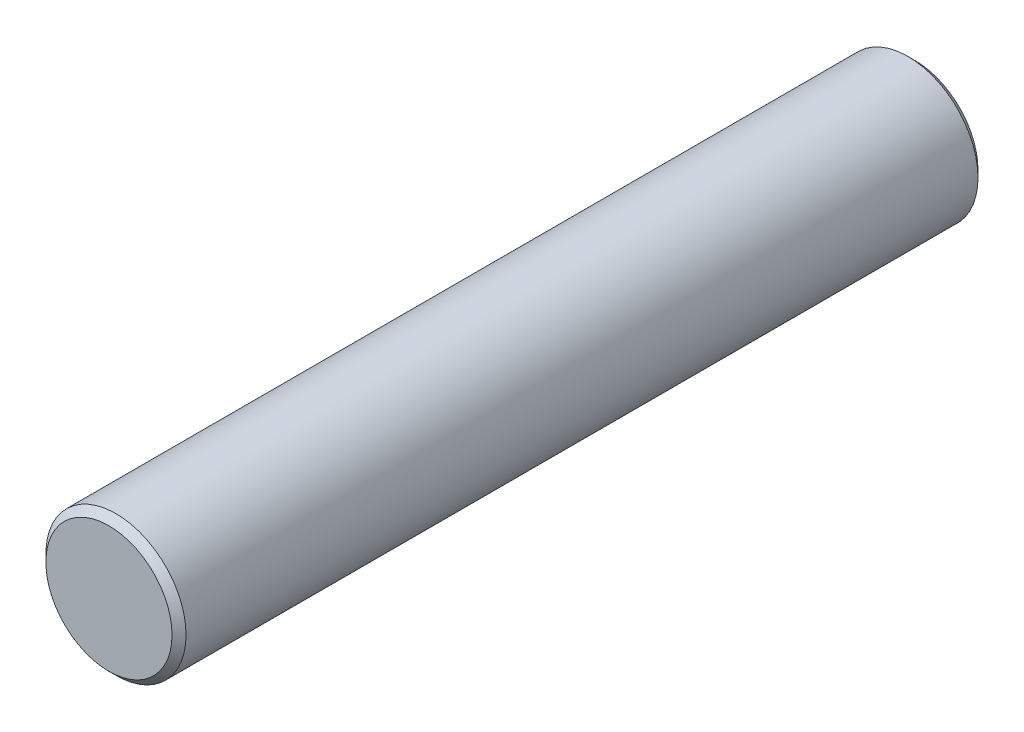
ISO-10303-21;
HEADER;
FILE_DESCRIPTION(('STEP AP214'),'2;1');
FILE_NAME('part.step','',(''),(''),'','','');
FILE_SCHEMA(('AUTOMOTIVE_DESIGN { 1 0 10303 214 1 1 1 1 }'));
ENDSEC;
DATA;
#1=APPLICATION_CONTEXT('core data for automotive mechanical design processes');
#2=APPLICATION_PROTOCOL_DEFINITION('international standard','automotive_design',2000,#1);
#3=PRODUCT_CONTEXT('',#1,'mechanical');
#4=PRODUCT('Part','Part','',(#3));
#5=PRODUCT_RELATED_PRODUCT_CATEGORY('part','',(#4));
#6=PRODUCT_DEFINITION_FORMATION('','',#4);
#7=PRODUCT_DEFINITION_CONTEXT('part definition',#1,'design');
#8=PRODUCT_DEFINITION('design','',#6,#7);
#9=PRODUCT_DEFINITION_SHAPE('','',#8);
#10=(LENGTH_UNIT() NAMED_UNIT(*) SI_UNIT(.MILLI.,.METRE.));
#11=(NAMED_UNIT(*) PLANE_ANGLE_UNIT() SI_UNIT($,.RADIAN.));
#12=(NAMED_UNIT(*) SI_UNIT($,.STERADIAN.) SOLID_ANGLE_UNIT());
#13=UNCERTAINTY_MEASURE_WITH_UNIT(LENGTH_MEASURE(1.E-05),#10,'distance_accuracy_value','');
#14=(GEOMETRIC_REPRESENTATION_CONTEXT(3) GLOBAL_UNCERTAINTY_ASSIGNED_CONTEXT((#13)) GLOBAL_UNIT_ASSIGNED_CONTEXT((#10,
#11,#12)) REPRESENTATION_CONTEXT('',''));
#15=CARTESIAN_POINT('',(0.,0.,0.));
#16=DIRECTION('',(0.,0.,1.));
#17=DIRECTION('',(1.,0.,0.));
#18=AXIS2_PLACEMENT_3D('',#15,#16,#17);
#19=CARTESIAN_POINT('',(0.,0.,23.));
#20=DIRECTION('',(0.,0.,-1.));
#21=DIRECTION('',(-1.,0.,0.));
#22=AXIS2_PLACEMENT_3D('',#19,#20,#21);
#23=CYLINDRICAL_SURFACE('',#22,2.);
#24=CARTESIAN_POINT('',(0.,0.,0.199999999999999));
#25=DIRECTION('',(0.,0.,1.));
#26=DIRECTION('',(1.,0.,0.));
#27=AXIS2_PLACEMENT_3D('',#24,#25,#26);
#28=CIRCLE('',#27,2.);
#29=CARTESIAN_POINT('',(2.,0.,0.199999999999999));
#30=VERTEX_POINT('',#29);
#31=EDGE_CURVE('E52',#30,#30,#28,.T.);
#32=ORIENTED_EDGE('',*,*,#31,.T.);
#33=EDGE_LOOP('',(#32));
#34=FACE_BOUND('',#33,.T.);
#35=CARTESIAN_POINT('',(0.,0.,22.8));
#36=DIRECTION('',(0.,0.,1.));
#37=DIRECTION('',(1.,0.,0.));
#38=AXIS2_PLACEMENT_3D('',#35,#36,#37);
#39=CIRCLE('',#38,2.);
#40=CARTESIAN_POINT('',(2.,0.,22.8));
#41=VERTEX_POINT('',#40);
#42=EDGE_CURVE('E57',#41,#41,#39,.F.);
#43=ORIENTED_EDGE('',*,*,#42,.T.);
#44=EDGE_LOOP('',(#43));
#45=FACE_BOUND('',#44,.T.);
#46=ADVANCED_FACE('F38',(#34,#45),#23,.T.);
#47=CARTESIAN_POINT('',(0.,0.,23.));
#48=DIRECTION('',(0.,0.,1.));
#49=DIRECTION('',(1.,0.,0.));
#50=AXIS2_PLACEMENT_3D('',#47,#48,#49);
#51=PLANE('',#50);
#52=CARTESIAN_POINT('',(0.,0.,23.));
#53=DIRECTION('',(0.,0.,1.));
#54=DIRECTION('',(1.,0.,0.));
#55=AXIS2_PLACEMENT_3D('',#52,#53,#54);
#56=CIRCLE('',#55,1.8);
#57=CARTESIAN_POINT('',(1.8,0.,23.));
#58=VERTEX_POINT('',#57);
#59=EDGE_CURVE('E10',#58,#58,#56,.T.);
#60=ORIENTED_EDGE('',*,*,#59,.T.);
#61=EDGE_LOOP('',(#60));
#62=FACE_BOUND('',#61,.T.);
#63=ADVANCED_FACE('F73',(#62),#51,.T.);
#64=CARTESIAN_POINT('',(0.,0.,0.));
#65=DIRECTION('',(0.,0.,1.));
#66=DIRECTION('',(1.,0.,0.));
#67=AXIS2_PLACEMENT_3D('',#64,#65,#66);
#68=PLANE('',#67);
#69=CARTESIAN_POINT('',(0.,0.,0.));
#70=DIRECTION('',(0.,0.,1.));
#71=DIRECTION('',(1.,0.,0.));
#72=AXIS2_PLACEMENT_3D('',#69,#70,#71);
#73=CIRCLE('',#72,1.8);
#74=CARTESIAN_POINT('',(1.8,0.,0.));
#75=VERTEX_POINT('',#74);
#76=EDGE_CURVE('E46',#75,#75,#73,.F.);
#77=ORIENTED_EDGE('',*,*,#76,.T.);
#78=EDGE_LOOP('',(#77));
#79=FACE_BOUND('',#78,.T.);
#80=ADVANCED_FACE('F70',(#79),#68,.F.);
#81=CARTESIAN_POINT('',(0.,0.,0.199999999999999));
#82=DIRECTION('',(0.,0.,1.));
#83=DIRECTION('',(1.,0.,0.));
#84=AXIS2_PLACEMENT_3D('',#81,#82,#83);
#85=CONICAL_SURFACE('',#84,2.,0.785398163397447);
#86=ORIENTED_EDGE('',*,*,#76,.F.);
#87=EDGE_LOOP('',(#86));
#88=FACE_BOUND('',#87,.T.);
#89=ORIENTED_EDGE('',*,*,#31,.F.);
#90=EDGE_LOOP('',(#89));
#91=FACE_BOUND('',#90,.T.);
#92=ADVANCED_FACE('F66',(#88,#91),#85,.T.);
#93=CARTESIAN_POINT('',(0.,0.,23.));
#94=DIRECTION('',(0.,0.,-1.));
#95=DIRECTION('',(-1.,0.,0.));
#96=AXIS2_PLACEMENT_3D('',#93,#94,#95);
#97=CONICAL_SURFACE('',#96,1.8,0.785398163397443);
#98=ORIENTED_EDGE('',*,*,#42,.F.);
#99=EDGE_LOOP('',(#98));
#100=FACE_BOUND('',#99,.T.);
#101=ORIENTED_EDGE('',*,*,#59,.F.);
#102=EDGE_LOOP('',(#101));
#103=FACE_BOUND('',#102,.T.);
#104=ADVANCED_FACE('F40',(#100,#103),#97,.T.);
#105=CLOSED_SHELL('',(#46,#63,#80,#92,#104));
#106=MANIFOLD_SOLID_BREP('B2',#105);
#107=ADVANCED_BREP_SHAPE_REPRESENTATION('',(#18,#106),#14);
#108=SHAPE_DEFINITION_REPRESENTATION(#9,#107);
ENDSEC;
END-ISO-10303-21;
